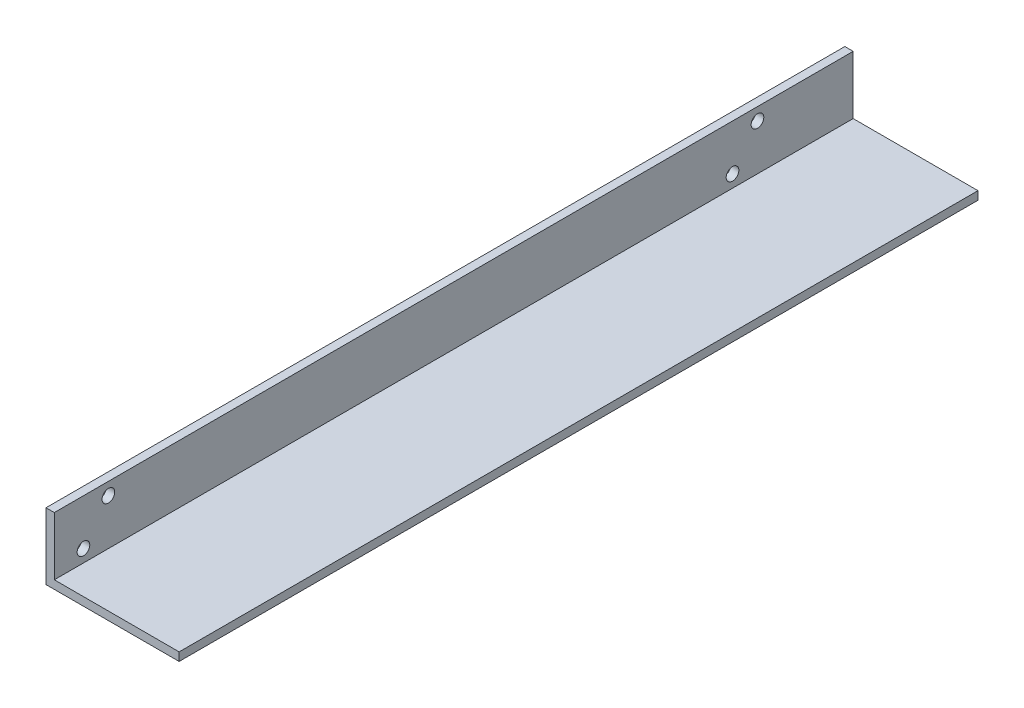
ISO-10303-21;
HEADER;
FILE_DESCRIPTION(('STEP AP214'),'2;1');
FILE_NAME('part.step','',(''),(''),'','','');
FILE_SCHEMA(('AUTOMOTIVE_DESIGN { 1 0 10303 214 1 1 1 1 }'));
ENDSEC;
DATA;
#1=APPLICATION_CONTEXT('core data for automotive mechanical design processes');
#2=APPLICATION_PROTOCOL_DEFINITION('international standard','automotive_design',2000,#1);
#3=PRODUCT_CONTEXT('',#1,'mechanical');
#4=PRODUCT('Part','Part','',(#3));
#5=PRODUCT_RELATED_PRODUCT_CATEGORY('part','',(#4));
#6=PRODUCT_DEFINITION_FORMATION('','',#4);
#7=PRODUCT_DEFINITION_CONTEXT('part definition',#1,'design');
#8=PRODUCT_DEFINITION('design','',#6,#7);
#9=PRODUCT_DEFINITION_SHAPE('','',#8);
#10=(LENGTH_UNIT() NAMED_UNIT(*) SI_UNIT(.MILLI.,.METRE.));
#11=(NAMED_UNIT(*) PLANE_ANGLE_UNIT() SI_UNIT($,.RADIAN.));
#12=(NAMED_UNIT(*) SI_UNIT($,.STERADIAN.) SOLID_ANGLE_UNIT());
#13=UNCERTAINTY_MEASURE_WITH_UNIT(LENGTH_MEASURE(1.E-05),#10,'distance_accuracy_value','');
#14=(GEOMETRIC_REPRESENTATION_CONTEXT(3) GLOBAL_UNCERTAINTY_ASSIGNED_CONTEXT((#13)) GLOBAL_UNIT_ASSIGNED_CONTEXT((#10,
#11,#12)) REPRESENTATION_CONTEXT('',''));
#15=CARTESIAN_POINT('',(0.,0.,0.));
#16=DIRECTION('',(0.,0.,1.));
#17=DIRECTION('',(1.,0.,0.));
#18=AXIS2_PLACEMENT_3D('',#15,#16,#17);
#19=CARTESIAN_POINT('',(0.,0.,304.8));
#20=DIRECTION('',(1.,0.,0.));
#21=DIRECTION('',(0.,0.,-1.));
#22=AXIS2_PLACEMENT_3D('',#19,#20,#21);
#23=PLANE('',#22);
#24=CARTESIAN_POINT('',(0.,20.6374999999999,36.5124999999999));
#25=DIRECTION('',(-1.,0.,0.));
#26=DIRECTION('',(0.,0.,1.));
#27=AXIS2_PLACEMENT_3D('',#24,#25,#26);
#28=CIRCLE('',#27,2.41299999999999);
#29=CARTESIAN_POINT('',(0.,20.6374999999999,38.9254999999999));
#30=VERTEX_POINT('',#29);
#31=EDGE_CURVE('E194',#30,#30,#28,.T.);
#32=ORIENTED_EDGE('',*,*,#31,.F.);
#33=EDGE_LOOP('',(#32));
#34=FACE_BOUND('',#33,.T.);
#35=CARTESIAN_POINT('',(0.,7.93749999999993,46.0374999999999));
#36=DIRECTION('',(-1.,0.,0.));
#37=DIRECTION('',(0.,0.,1.));
#38=AXIS2_PLACEMENT_3D('',#35,#36,#37);
#39=CIRCLE('',#38,2.41299999999999);
#40=CARTESIAN_POINT('',(0.,7.93749999999993,48.4504999999999));
#41=VERTEX_POINT('',#40);
#42=EDGE_CURVE('E198',#41,#41,#39,.T.);
#43=ORIENTED_EDGE('',*,*,#42,.F.);
#44=EDGE_LOOP('',(#43));
#45=FACE_BOUND('',#44,.T.);
#46=CARTESIAN_POINT('',(0.,20.6374999999999,284.1625));
#47=DIRECTION('',(-1.,0.,0.));
#48=DIRECTION('',(0.,0.,1.));
#49=AXIS2_PLACEMENT_3D('',#46,#47,#48);
#50=CIRCLE('',#49,2.41300000000005);
#51=CARTESIAN_POINT('',(0.,20.6374999999999,286.5755));
#52=VERTEX_POINT('',#51);
#53=EDGE_CURVE('E202',#52,#52,#50,.T.);
#54=ORIENTED_EDGE('',*,*,#53,.F.);
#55=EDGE_LOOP('',(#54));
#56=FACE_BOUND('',#55,.T.);
#57=CARTESIAN_POINT('',(0.,7.9375000000001,293.6875));
#58=DIRECTION('',(-1.,0.,0.));
#59=DIRECTION('',(0.,0.,1.));
#60=AXIS2_PLACEMENT_3D('',#57,#58,#59);
#61=CIRCLE('',#60,2.41299999999999);
#62=CARTESIAN_POINT('',(0.,7.9375000000001,296.1005));
#63=VERTEX_POINT('',#62);
#64=EDGE_CURVE('E205',#63,#63,#61,.T.);
#65=ORIENTED_EDGE('',*,*,#64,.F.);
#66=EDGE_LOOP('',(#65));
#67=FACE_BOUND('',#66,.T.);
#68=DIRECTION('',(0.,-1.,0.));
#69=VECTOR('',#68,1.);
#70=CARTESIAN_POINT('',(0.,0.,0.));
#71=LINE('',#70,#69);
#72=CARTESIAN_POINT('',(0.,25.4,0.));
#73=VERTEX_POINT('',#72);
#74=CARTESIAN_POINT('',(0.,0.,0.));
#75=VERTEX_POINT('',#74);
#76=EDGE_CURVE('E140',#73,#75,#71,.T.);
#77=ORIENTED_EDGE('',*,*,#76,.T.);
#78=DIRECTION('',(0.,0.,-1.));
#79=VECTOR('',#78,1.);
#80=CARTESIAN_POINT('',(0.,0.,304.8));
#81=LINE('',#80,#79);
#82=CARTESIAN_POINT('',(0.,0.,304.8));
#83=VERTEX_POINT('',#82);
#84=EDGE_CURVE('E11',#83,#75,#81,.T.);
#85=ORIENTED_EDGE('',*,*,#84,.F.);
#86=DIRECTION('',(0.,-1.,0.));
#87=VECTOR('',#86,1.);
#88=CARTESIAN_POINT('',(0.,0.,304.8));
#89=LINE('',#88,#87);
#90=CARTESIAN_POINT('',(0.,25.4,304.8));
#91=VERTEX_POINT('',#90);
#92=EDGE_CURVE('E157',#91,#83,#89,.T.);
#93=ORIENTED_EDGE('',*,*,#92,.F.);
#94=DIRECTION('',(0.,0.,-1.));
#95=VECTOR('',#94,1.);
#96=CARTESIAN_POINT('',(0.,25.4,304.8));
#97=LINE('',#96,#95);
#98=EDGE_CURVE('E136',#91,#73,#97,.T.);
#99=ORIENTED_EDGE('',*,*,#98,.T.);
#100=EDGE_LOOP('',(#77,#85,#93,#99));
#101=FACE_BOUND('',#100,.T.);
#102=ADVANCED_FACE('F39',(#34,#45,#56,#67,#101),#23,.F.);
#103=CARTESIAN_POINT('',(0.,0.,304.8));
#104=DIRECTION('',(0.,1.,0.));
#105=DIRECTION('',(0.,0.,1.));
#106=AXIS2_PLACEMENT_3D('',#103,#104,#105);
#107=PLANE('',#106);
#108=DIRECTION('',(1.,0.,0.));
#109=VECTOR('',#108,1.);
#110=CARTESIAN_POINT('',(0.,0.,0.));
#111=LINE('',#110,#109);
#112=CARTESIAN_POINT('',(50.8,0.,0.));
#113=VERTEX_POINT('',#112);
#114=EDGE_CURVE('E144',#75,#113,#111,.T.);
#115=ORIENTED_EDGE('',*,*,#114,.T.);
#116=DIRECTION('',(0.,0.,-1.));
#117=VECTOR('',#116,1.);
#118=CARTESIAN_POINT('',(50.8,0.,304.8));
#119=LINE('',#118,#117);
#120=CARTESIAN_POINT('',(50.8,0.,304.8));
#121=VERTEX_POINT('',#120);
#122=EDGE_CURVE('E48',#121,#113,#119,.T.);
#123=ORIENTED_EDGE('',*,*,#122,.F.);
#124=DIRECTION('',(1.,0.,0.));
#125=VECTOR('',#124,1.);
#126=CARTESIAN_POINT('',(0.,0.,304.8));
#127=LINE('',#126,#125);
#128=EDGE_CURVE('E104',#83,#121,#127,.T.);
#129=ORIENTED_EDGE('',*,*,#128,.F.);
#130=ORIENTED_EDGE('',*,*,#84,.T.);
#131=EDGE_LOOP('',(#115,#123,#129,#130));
#132=FACE_BOUND('',#131,.T.);
#133=ADVANCED_FACE('F186',(#132),#107,.F.);
#134=CARTESIAN_POINT('',(50.8,0.,304.8));
#135=DIRECTION('',(-1.,0.,0.));
#136=DIRECTION('',(0.,0.,1.));
#137=AXIS2_PLACEMENT_3D('',#134,#135,#136);
#138=PLANE('',#137);
#139=DIRECTION('',(0.,1.,0.));
#140=VECTOR('',#139,1.);
#141=CARTESIAN_POINT('',(50.8,0.,0.));
#142=LINE('',#141,#140);
#143=CARTESIAN_POINT('',(50.8,3.175,0.));
#144=VERTEX_POINT('',#143);
#145=EDGE_CURVE('E148',#113,#144,#142,.T.);
#146=ORIENTED_EDGE('',*,*,#145,.T.);
#147=DIRECTION('',(0.,0.,-1.));
#148=VECTOR('',#147,1.);
#149=CARTESIAN_POINT('',(50.8,3.175,304.8));
#150=LINE('',#149,#148);
#151=CARTESIAN_POINT('',(50.8,3.175,304.8));
#152=VERTEX_POINT('',#151);
#153=EDGE_CURVE('E129',#152,#144,#150,.T.);
#154=ORIENTED_EDGE('',*,*,#153,.F.);
#155=DIRECTION('',(0.,1.,0.));
#156=VECTOR('',#155,1.);
#157=CARTESIAN_POINT('',(50.8,0.,304.8));
#158=LINE('',#157,#156);
#159=EDGE_CURVE('E118',#121,#152,#158,.T.);
#160=ORIENTED_EDGE('',*,*,#159,.F.);
#161=ORIENTED_EDGE('',*,*,#122,.T.);
#162=EDGE_LOOP('',(#146,#154,#160,#161));
#163=FACE_BOUND('',#162,.T.);
#164=ADVANCED_FACE('F167',(#163),#138,.F.);
#165=CARTESIAN_POINT('',(3.175,3.175,304.8));
#166=DIRECTION('',(0.,-1.,0.));
#167=DIRECTION('',(0.,0.,-1.));
#168=AXIS2_PLACEMENT_3D('',#165,#166,#167);
#169=PLANE('',#168);
#170=DIRECTION('',(-1.,0.,0.));
#171=VECTOR('',#170,1.);
#172=CARTESIAN_POINT('',(3.175,3.175,0.));
#173=LINE('',#172,#171);
#174=CARTESIAN_POINT('',(3.175,3.175,0.));
#175=VERTEX_POINT('',#174);
#176=EDGE_CURVE('E127',#144,#175,#173,.T.);
#177=ORIENTED_EDGE('',*,*,#176,.T.);
#178=DIRECTION('',(0.,0.,-1.));
#179=VECTOR('',#178,1.);
#180=CARTESIAN_POINT('',(3.175,3.175,304.8));
#181=LINE('',#180,#179);
#182=CARTESIAN_POINT('',(3.175,3.175,304.8));
#183=VERTEX_POINT('',#182);
#184=EDGE_CURVE('E124',#183,#175,#181,.T.);
#185=ORIENTED_EDGE('',*,*,#184,.F.);
#186=DIRECTION('',(-1.,0.,0.));
#187=VECTOR('',#186,1.);
#188=CARTESIAN_POINT('',(3.175,3.175,304.8));
#189=LINE('',#188,#187);
#190=EDGE_CURVE('E112',#152,#183,#189,.T.);
#191=ORIENTED_EDGE('',*,*,#190,.F.);
#192=ORIENTED_EDGE('',*,*,#153,.T.);
#193=EDGE_LOOP('',(#177,#185,#191,#192));
#194=FACE_BOUND('',#193,.T.);
#195=ADVANCED_FACE('F125',(#194),#169,.F.);
#196=CARTESIAN_POINT('',(3.175,3.175,304.8));
#197=DIRECTION('',(-1.,0.,0.));
#198=DIRECTION('',(0.,0.,1.));
#199=AXIS2_PLACEMENT_3D('',#196,#197,#198);
#200=PLANE('',#199);
#201=CARTESIAN_POINT('',(3.175,20.6374999999999,36.5124999999999));
#202=DIRECTION('',(-1.,0.,0.));
#203=DIRECTION('',(0.,0.,1.));
#204=AXIS2_PLACEMENT_3D('',#201,#202,#203);
#205=CIRCLE('',#204,2.41299999999999);
#206=CARTESIAN_POINT('',(3.175,20.6374999999999,38.9254999999999));
#207=VERTEX_POINT('',#206);
#208=EDGE_CURVE('E145',#207,#207,#205,.F.);
#209=ORIENTED_EDGE('',*,*,#208,.F.);
#210=EDGE_LOOP('',(#209));
#211=FACE_BOUND('',#210,.T.);
#212=CARTESIAN_POINT('',(3.175,7.93749999999993,46.0374999999999));
#213=DIRECTION('',(-1.,0.,0.));
#214=DIRECTION('',(0.,0.,1.));
#215=AXIS2_PLACEMENT_3D('',#212,#213,#214);
#216=CIRCLE('',#215,2.41299999999999);
#217=CARTESIAN_POINT('',(3.175,7.93749999999993,48.4504999999999));
#218=VERTEX_POINT('',#217);
#219=EDGE_CURVE('E224',#218,#218,#216,.F.);
#220=ORIENTED_EDGE('',*,*,#219,.F.);
#221=EDGE_LOOP('',(#220));
#222=FACE_BOUND('',#221,.T.);
#223=CARTESIAN_POINT('',(3.175,20.6374999999999,284.1625));
#224=DIRECTION('',(-1.,0.,0.));
#225=DIRECTION('',(0.,0.,1.));
#226=AXIS2_PLACEMENT_3D('',#223,#224,#225);
#227=CIRCLE('',#226,2.41300000000005);
#228=CARTESIAN_POINT('',(3.175,20.6374999999999,286.5755));
#229=VERTEX_POINT('',#228);
#230=EDGE_CURVE('E216',#229,#229,#227,.F.);
#231=ORIENTED_EDGE('',*,*,#230,.F.);
#232=EDGE_LOOP('',(#231));
#233=FACE_BOUND('',#232,.T.);
#234=CARTESIAN_POINT('',(3.175,7.9375000000001,293.6875));
#235=DIRECTION('',(-1.,0.,0.));
#236=DIRECTION('',(0.,0.,1.));
#237=AXIS2_PLACEMENT_3D('',#234,#235,#236);
#238=CIRCLE('',#237,2.41299999999999);
#239=CARTESIAN_POINT('',(3.175,7.9375000000001,296.1005));
#240=VERTEX_POINT('',#239);
#241=EDGE_CURVE('E208',#240,#240,#238,.F.);
#242=ORIENTED_EDGE('',*,*,#241,.F.);
#243=EDGE_LOOP('',(#242));
#244=FACE_BOUND('',#243,.T.);
#245=DIRECTION('',(0.,1.,0.));
#246=VECTOR('',#245,1.);
#247=CARTESIAN_POINT('',(3.175,3.175,0.));
#248=LINE('',#247,#246);
#249=CARTESIAN_POINT('',(3.175,25.4,0.));
#250=VERTEX_POINT('',#249);
#251=EDGE_CURVE('E88',#175,#250,#248,.T.);
#252=ORIENTED_EDGE('',*,*,#251,.T.);
#253=DIRECTION('',(0.,0.,-1.));
#254=VECTOR('',#253,1.);
#255=CARTESIAN_POINT('',(3.175,25.4,304.8));
#256=LINE('',#255,#254);
#257=CARTESIAN_POINT('',(3.175,25.4,304.8));
#258=VERTEX_POINT('',#257);
#259=EDGE_CURVE('E130',#258,#250,#256,.T.);
#260=ORIENTED_EDGE('',*,*,#259,.F.);
#261=DIRECTION('',(0.,1.,0.));
#262=VECTOR('',#261,1.);
#263=CARTESIAN_POINT('',(3.175,3.175,304.8));
#264=LINE('',#263,#262);
#265=EDGE_CURVE('E116',#183,#258,#264,.T.);
#266=ORIENTED_EDGE('',*,*,#265,.F.);
#267=ORIENTED_EDGE('',*,*,#184,.T.);
#268=EDGE_LOOP('',(#252,#260,#266,#267));
#269=FACE_BOUND('',#268,.T.);
#270=ADVANCED_FACE('F132',(#211,#222,#233,#244,#269),#200,.F.);
#271=CARTESIAN_POINT('',(0.,25.4,304.8));
#272=DIRECTION('',(0.,-1.,0.));
#273=DIRECTION('',(0.,0.,-1.));
#274=AXIS2_PLACEMENT_3D('',#271,#272,#273);
#275=PLANE('',#274);
#276=DIRECTION('',(-1.,0.,0.));
#277=VECTOR('',#276,1.);
#278=CARTESIAN_POINT('',(0.,25.4,0.));
#279=LINE('',#278,#277);
#280=EDGE_CURVE('E94',#250,#73,#279,.T.);
#281=ORIENTED_EDGE('',*,*,#280,.T.);
#282=ORIENTED_EDGE('',*,*,#98,.F.);
#283=DIRECTION('',(-1.,0.,0.));
#284=VECTOR('',#283,1.);
#285=CARTESIAN_POINT('',(0.,25.4,304.8));
#286=LINE('',#285,#284);
#287=EDGE_CURVE('E59',#258,#91,#286,.T.);
#288=ORIENTED_EDGE('',*,*,#287,.F.);
#289=ORIENTED_EDGE('',*,*,#259,.T.);
#290=EDGE_LOOP('',(#281,#282,#288,#289));
#291=FACE_BOUND('',#290,.T.);
#292=ADVANCED_FACE('F174',(#291),#275,.F.);
#293=CARTESIAN_POINT('',(0.,0.,304.8));
#294=DIRECTION('',(0.,0.,-1.));
#295=DIRECTION('',(-1.,0.,0.));
#296=AXIS2_PLACEMENT_3D('',#293,#294,#295);
#297=PLANE('',#296);
#298=ORIENTED_EDGE('',*,*,#92,.T.);
#299=ORIENTED_EDGE('',*,*,#128,.T.);
#300=ORIENTED_EDGE('',*,*,#159,.T.);
#301=ORIENTED_EDGE('',*,*,#190,.T.);
#302=ORIENTED_EDGE('',*,*,#265,.T.);
#303=ORIENTED_EDGE('',*,*,#287,.T.);
#304=EDGE_LOOP('',(#298,#299,#300,#301,#302,#303));
#305=FACE_BOUND('',#304,.T.);
#306=ADVANCED_FACE('F114',(#305),#297,.F.);
#307=CARTESIAN_POINT('',(0.,0.,0.));
#308=DIRECTION('',(0.,0.,-1.));
#309=DIRECTION('',(-1.,0.,0.));
#310=AXIS2_PLACEMENT_3D('',#307,#308,#309);
#311=PLANE('',#310);
#312=ORIENTED_EDGE('',*,*,#76,.F.);
#313=ORIENTED_EDGE('',*,*,#280,.F.);
#314=ORIENTED_EDGE('',*,*,#251,.F.);
#315=ORIENTED_EDGE('',*,*,#176,.F.);
#316=ORIENTED_EDGE('',*,*,#145,.F.);
#317=ORIENTED_EDGE('',*,*,#114,.F.);
#318=EDGE_LOOP('',(#312,#313,#314,#315,#316,#317));
#319=FACE_BOUND('',#318,.T.);
#320=ADVANCED_FACE('F170',(#319),#311,.T.);
#321=CARTESIAN_POINT('',(50.801,7.9375000000001,293.6875));
#322=DIRECTION('',(-1.,0.,0.));
#323=DIRECTION('',(0.,0.,1.));
#324=AXIS2_PLACEMENT_3D('',#321,#322,#323);
#325=CYLINDRICAL_SURFACE('',#324,2.41299999999999);
#326=ORIENTED_EDGE('',*,*,#64,.T.);
#327=EDGE_LOOP('',(#326));
#328=FACE_BOUND('',#327,.T.);
#329=ORIENTED_EDGE('',*,*,#241,.T.);
#330=EDGE_LOOP('',(#329));
#331=FACE_BOUND('',#330,.T.);
#332=ADVANCED_FACE('F242',(#328,#331),#325,.F.);
#333=CARTESIAN_POINT('',(50.801,20.6374999999999,284.1625));
#334=DIRECTION('',(-1.,0.,0.));
#335=DIRECTION('',(0.,0.,1.));
#336=AXIS2_PLACEMENT_3D('',#333,#334,#335);
#337=CYLINDRICAL_SURFACE('',#336,2.41300000000005);
#338=ORIENTED_EDGE('',*,*,#53,.T.);
#339=EDGE_LOOP('',(#338));
#340=FACE_BOUND('',#339,.T.);
#341=ORIENTED_EDGE('',*,*,#230,.T.);
#342=EDGE_LOOP('',(#341));
#343=FACE_BOUND('',#342,.T.);
#344=ADVANCED_FACE('F237',(#340,#343),#337,.F.);
#345=CARTESIAN_POINT('',(50.801,7.93749999999993,46.0374999999999));
#346=DIRECTION('',(-1.,0.,0.));
#347=DIRECTION('',(0.,0.,1.));
#348=AXIS2_PLACEMENT_3D('',#345,#346,#347);
#349=CYLINDRICAL_SURFACE('',#348,2.41299999999999);
#350=ORIENTED_EDGE('',*,*,#42,.T.);
#351=EDGE_LOOP('',(#350));
#352=FACE_BOUND('',#351,.T.);
#353=ORIENTED_EDGE('',*,*,#219,.T.);
#354=EDGE_LOOP('',(#353));
#355=FACE_BOUND('',#354,.T.);
#356=ADVANCED_FACE('F249',(#352,#355),#349,.F.);
#357=CARTESIAN_POINT('',(50.801,20.6374999999999,36.5124999999999));
#358=DIRECTION('',(-1.,0.,0.));
#359=DIRECTION('',(0.,0.,1.));
#360=AXIS2_PLACEMENT_3D('',#357,#358,#359);
#361=CYLINDRICAL_SURFACE('',#360,2.41299999999999);
#362=ORIENTED_EDGE('',*,*,#31,.T.);
#363=EDGE_LOOP('',(#362));
#364=FACE_BOUND('',#363,.T.);
#365=ORIENTED_EDGE('',*,*,#208,.T.);
#366=EDGE_LOOP('',(#365));
#367=FACE_BOUND('',#366,.T.);
#368=ADVANCED_FACE('F255',(#364,#367),#361,.F.);
#369=CLOSED_SHELL('',(#102,#133,#164,#195,#270,#292,#306,#320,#332,#344,#356,#368));
#370=MANIFOLD_SOLID_BREP('B2',#369);
#371=ADVANCED_BREP_SHAPE_REPRESENTATION('',(#18,#370),#14);
#372=SHAPE_DEFINITION_REPRESENTATION(#9,#371);
ENDSEC;
END-ISO-10303-21;
